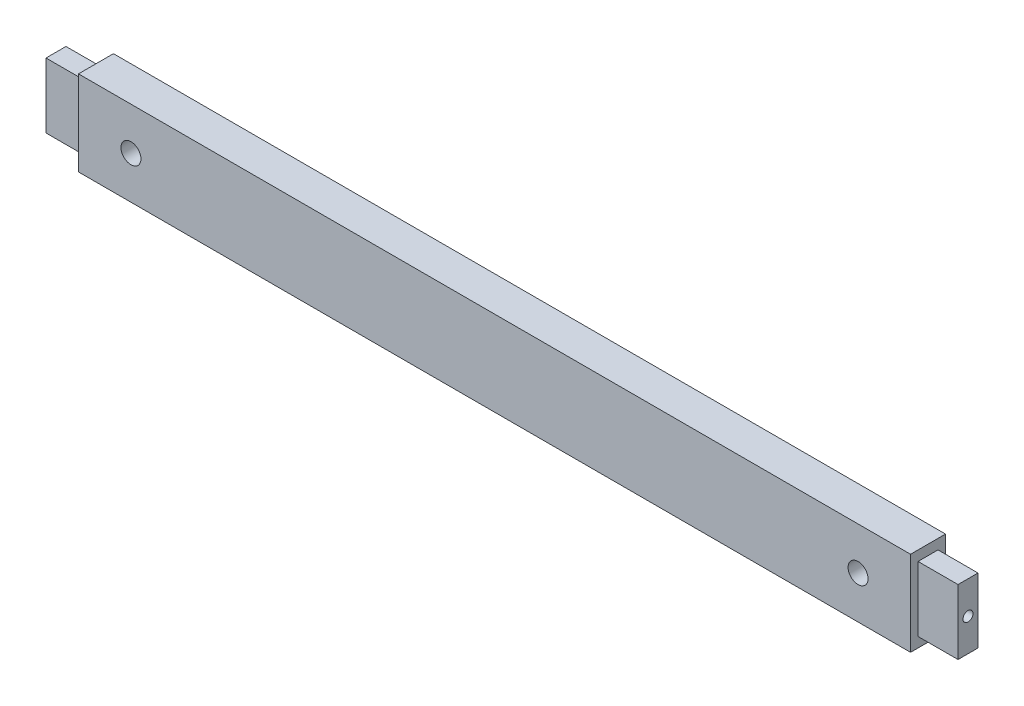
ISO-10303-21;
HEADER;
FILE_DESCRIPTION(('STEP AP214'),'2;1');
FILE_NAME('part.step','',(''),(''),'','','');
FILE_SCHEMA(('AUTOMOTIVE_DESIGN { 1 0 10303 214 1 1 1 1 }'));
ENDSEC;
DATA;
#1=APPLICATION_CONTEXT('core data for automotive mechanical design processes');
#2=APPLICATION_PROTOCOL_DEFINITION('international standard','automotive_design',2000,#1);
#3=PRODUCT_CONTEXT('',#1,'mechanical');
#4=PRODUCT('Part','Part','',(#3));
#5=PRODUCT_RELATED_PRODUCT_CATEGORY('part','',(#4));
#6=PRODUCT_DEFINITION_FORMATION('','',#4);
#7=PRODUCT_DEFINITION_CONTEXT('part definition',#1,'design');
#8=PRODUCT_DEFINITION('design','',#6,#7);
#9=PRODUCT_DEFINITION_SHAPE('','',#8);
#10=(LENGTH_UNIT() NAMED_UNIT(*) SI_UNIT(.MILLI.,.METRE.));
#11=(NAMED_UNIT(*) PLANE_ANGLE_UNIT() SI_UNIT($,.RADIAN.));
#12=(NAMED_UNIT(*) SI_UNIT($,.STERADIAN.) SOLID_ANGLE_UNIT());
#13=UNCERTAINTY_MEASURE_WITH_UNIT(LENGTH_MEASURE(1.E-05),#10,'distance_accuracy_value','');
#14=(GEOMETRIC_REPRESENTATION_CONTEXT(3) GLOBAL_UNCERTAINTY_ASSIGNED_CONTEXT((#13)) GLOBAL_UNIT_ASSIGNED_CONTEXT((#10,
#11,#12)) REPRESENTATION_CONTEXT('',''));
#15=CARTESIAN_POINT('',(0.,0.,0.));
#16=DIRECTION('',(0.,0.,1.));
#17=DIRECTION('',(1.,0.,0.));
#18=AXIS2_PLACEMENT_3D('',#15,#16,#17);
#19=CARTESIAN_POINT('',(0.,0.,-22.225));
#20=DIRECTION('',(0.,0.,-1.));
#21=DIRECTION('',(-1.,0.,0.));
#22=AXIS2_PLACEMENT_3D('',#19,#20,#21);
#23=PLANE('',#22);
#24=CARTESIAN_POINT('',(461.9625,0.,-22.225));
#25=DIRECTION('',(0.,0.,-1.));
#26=DIRECTION('',(-1.,0.,0.));
#27=AXIS2_PLACEMENT_3D('',#24,#25,#26);
#28=CIRCLE('',#27,12.7);
#29=CARTESIAN_POINT('',(449.2625,0.,-22.225));
#30=VERTEX_POINT('',#29);
#31=EDGE_CURVE('E412',#30,#30,#28,.T.);
#32=ORIENTED_EDGE('',*,*,#31,.F.);
#33=EDGE_LOOP('',(#32));
#34=FACE_BOUND('',#33,.T.);
#35=CARTESIAN_POINT('',(-461.962499999999,0.,-22.225));
#36=DIRECTION('',(0.,0.,-1.));
#37=DIRECTION('',(-1.,0.,0.));
#38=AXIS2_PLACEMENT_3D('',#35,#36,#37);
#39=CIRCLE('',#38,12.7);
#40=CARTESIAN_POINT('',(-474.662499999999,0.,-22.225));
#41=VERTEX_POINT('',#40);
#42=EDGE_CURVE('E407',#41,#41,#39,.T.);
#43=ORIENTED_EDGE('',*,*,#42,.F.);
#44=EDGE_LOOP('',(#43));
#45=FACE_BOUND('',#44,.T.);
#46=DIRECTION('',(-1.,0.,0.));
#47=VECTOR('',#46,1.);
#48=CARTESIAN_POINT('',(0.,19.0499999999995,-22.225));
#49=LINE('',#48,#47);
#50=CARTESIAN_POINT('',(528.6375,19.05,-22.225));
#51=VERTEX_POINT('',#50);
#52=CARTESIAN_POINT('',(-528.637499999999,19.0499999999989,-22.225));
#53=VERTEX_POINT('',#52);
#54=EDGE_CURVE('E46',#51,#53,#49,.T.);
#55=ORIENTED_EDGE('',*,*,#54,.F.);
#56=DIRECTION('',(0.,1.,0.));
#57=VECTOR('',#56,1.);
#58=CARTESIAN_POINT('',(528.6375,53.975,-22.225));
#59=LINE('',#58,#57);
#60=CARTESIAN_POINT('',(528.6375,-53.975,-22.225));
#61=VERTEX_POINT('',#60);
#62=EDGE_CURVE('E177',#61,#51,#59,.T.);
#63=ORIENTED_EDGE('',*,*,#62,.F.);
#64=DIRECTION('',(1.,0.,0.));
#65=VECTOR('',#64,1.);
#66=CARTESIAN_POINT('',(528.6375,-53.975,-22.225));
#67=LINE('',#66,#65);
#68=CARTESIAN_POINT('',(-528.637499999999,-53.9750000000001,-22.225));
#69=VERTEX_POINT('',#68);
#70=EDGE_CURVE('E178',#69,#61,#67,.T.);
#71=ORIENTED_EDGE('',*,*,#70,.F.);
#72=DIRECTION('',(0.,-1.,0.));
#73=VECTOR('',#72,1.);
#74=CARTESIAN_POINT('',(-528.637499999999,53.9749999999999,-22.225));
#75=LINE('',#74,#73);
#76=EDGE_CURVE('E373',#53,#69,#75,.T.);
#77=ORIENTED_EDGE('',*,*,#76,.F.);
#78=EDGE_LOOP('',(#55,#63,#71,#77));
#79=FACE_BOUND('',#78,.T.);
#80=ADVANCED_FACE('F33',(#34,#45,#79),#23,.T.);
#81=CARTESIAN_POINT('',(528.6375,53.975,22.225));
#82=DIRECTION('',(-1.,0.,0.));
#83=DIRECTION('',(0.,-1.,0.));
#84=AXIS2_PLACEMENT_3D('',#81,#82,#83);
#85=PLANE('',#84);
#86=ORIENTED_EDGE('',*,*,#62,.T.);
#87=DIRECTION('',(0.,0.,-1.));
#88=VECTOR('',#87,1.);
#89=CARTESIAN_POINT('',(528.6375,19.05,-22.225));
#90=LINE('',#89,#88);
#91=CARTESIAN_POINT('',(528.6375,19.05,-19.05));
#92=VERTEX_POINT('',#91);
#93=EDGE_CURVE('E396',#92,#51,#90,.T.);
#94=ORIENTED_EDGE('',*,*,#93,.F.);
#95=DIRECTION('',(0.,-1.,0.));
#96=VECTOR('',#95,1.);
#97=CARTESIAN_POINT('',(528.6375,28.575,-19.05));
#98=LINE('',#97,#96);
#99=CARTESIAN_POINT('',(528.6375,28.575,-19.05));
#100=VERTEX_POINT('',#99);
#101=EDGE_CURVE('E171',#100,#92,#98,.T.);
#102=ORIENTED_EDGE('',*,*,#101,.F.);
#103=DIRECTION('',(0.,0.,1.));
#104=VECTOR('',#103,1.);
#105=CARTESIAN_POINT('',(528.6375,28.575,-22.225));
#106=LINE('',#105,#104);
#107=CARTESIAN_POINT('',(528.6375,28.575,-22.225));
#108=VERTEX_POINT('',#107);
#109=EDGE_CURVE('E154',#108,#100,#106,.T.);
#110=ORIENTED_EDGE('',*,*,#109,.F.);
#111=CARTESIAN_POINT('',(528.6375,53.975,-22.225));
#112=VERTEX_POINT('',#111);
#113=EDGE_CURVE('E167',#108,#112,#59,.T.);
#114=ORIENTED_EDGE('',*,*,#113,.T.);
#115=DIRECTION('',(0.,0.,-1.));
#116=VECTOR('',#115,1.);
#117=CARTESIAN_POINT('',(528.6375,53.975,22.225));
#118=LINE('',#117,#116);
#119=CARTESIAN_POINT('',(528.6375,53.975,22.225));
#120=VERTEX_POINT('',#119);
#121=EDGE_CURVE('E189',#120,#112,#118,.T.);
#122=ORIENTED_EDGE('',*,*,#121,.F.);
#123=DIRECTION('',(0.,1.,0.));
#124=VECTOR('',#123,1.);
#125=CARTESIAN_POINT('',(528.6375,53.975,22.225));
#126=LINE('',#125,#124);
#127=CARTESIAN_POINT('',(528.6375,-53.975,22.225));
#128=VERTEX_POINT('',#127);
#129=EDGE_CURVE('E378',#128,#120,#126,.T.);
#130=ORIENTED_EDGE('',*,*,#129,.F.);
#131=DIRECTION('',(0.,0.,-1.));
#132=VECTOR('',#131,1.);
#133=CARTESIAN_POINT('',(528.6375,-53.975,22.225));
#134=LINE('',#133,#132);
#135=EDGE_CURVE('E192',#128,#61,#134,.T.);
#136=ORIENTED_EDGE('',*,*,#135,.T.);
#137=EDGE_LOOP('',(#86,#94,#102,#110,#114,#122,#130,#136));
#138=FACE_BOUND('',#137,.T.);
#139=DIRECTION('',(0.,-1.,0.));
#140=VECTOR('',#139,1.);
#141=CARTESIAN_POINT('',(528.6375,41.2750000000005,12.7));
#142=LINE('',#141,#140);
#143=CARTESIAN_POINT('',(528.6375,41.2750000000005,12.7));
#144=VERTEX_POINT('',#143);
#145=CARTESIAN_POINT('',(528.6375,-41.2749999999994,12.7));
#146=VERTEX_POINT('',#145);
#147=EDGE_CURVE('E340',#144,#146,#142,.T.);
#148=ORIENTED_EDGE('',*,*,#147,.F.);
#149=DIRECTION('',(0.,0.,1.));
#150=VECTOR('',#149,1.);
#151=CARTESIAN_POINT('',(528.6375,41.2750000000005,-12.7));
#152=LINE('',#151,#150);
#153=CARTESIAN_POINT('',(528.6375,41.2750000000005,-12.7));
#154=VERTEX_POINT('',#153);
#155=EDGE_CURVE('E345',#154,#144,#152,.T.);
#156=ORIENTED_EDGE('',*,*,#155,.F.);
#157=DIRECTION('',(0.,1.,0.));
#158=VECTOR('',#157,1.);
#159=CARTESIAN_POINT('',(528.6375,41.2750000000005,-12.7));
#160=LINE('',#159,#158);
#161=CARTESIAN_POINT('',(528.6375,-41.2749999999995,-12.7));
#162=VERTEX_POINT('',#161);
#163=EDGE_CURVE('E357',#162,#154,#160,.T.);
#164=ORIENTED_EDGE('',*,*,#163,.F.);
#165=DIRECTION('',(0.,0.,-1.));
#166=VECTOR('',#165,1.);
#167=CARTESIAN_POINT('',(528.6375,-41.2749999999995,-12.7));
#168=LINE('',#167,#166);
#169=EDGE_CURVE('E354',#146,#162,#168,.T.);
#170=ORIENTED_EDGE('',*,*,#169,.F.);
#171=EDGE_LOOP('',(#148,#156,#164,#170));
#172=FACE_BOUND('',#171,.T.);
#173=ADVANCED_FACE('F164',(#138,#172),#85,.F.);
#174=CARTESIAN_POINT('',(-528.637499999999,53.9749999999999,22.225));
#175=DIRECTION('',(1.,0.,0.));
#176=DIRECTION('',(0.,0.,-1.));
#177=AXIS2_PLACEMENT_3D('',#174,#175,#176);
#178=PLANE('',#177);
#179=DIRECTION('',(0.,0.,1.));
#180=VECTOR('',#179,1.);
#181=CARTESIAN_POINT('',(-528.6375,41.2750000000005,-12.7));
#182=LINE('',#181,#180);
#183=CARTESIAN_POINT('',(-528.6375,41.2750000000005,-12.7));
#184=VERTEX_POINT('',#183);
#185=CARTESIAN_POINT('',(-528.6375,41.2750000000005,12.7));
#186=VERTEX_POINT('',#185);
#187=EDGE_CURVE('E326',#184,#186,#182,.T.);
#188=ORIENTED_EDGE('',*,*,#187,.T.);
#189=DIRECTION('',(0.,-1.,0.));
#190=VECTOR('',#189,1.);
#191=CARTESIAN_POINT('',(-528.6375,41.2750000000005,12.7));
#192=LINE('',#191,#190);
#193=CARTESIAN_POINT('',(-528.6375,-41.2749999999995,12.7));
#194=VERTEX_POINT('',#193);
#195=EDGE_CURVE('E323',#186,#194,#192,.T.);
#196=ORIENTED_EDGE('',*,*,#195,.T.);
#197=DIRECTION('',(0.,0.,-1.));
#198=VECTOR('',#197,1.);
#199=CARTESIAN_POINT('',(-528.6375,-41.2749999999995,-12.7));
#200=LINE('',#199,#198);
#201=CARTESIAN_POINT('',(-528.637499999999,-41.2749999999995,-12.7));
#202=VERTEX_POINT('',#201);
#203=EDGE_CURVE('E310',#194,#202,#200,.T.);
#204=ORIENTED_EDGE('',*,*,#203,.T.);
#205=DIRECTION('',(0.,1.,0.));
#206=VECTOR('',#205,1.);
#207=CARTESIAN_POINT('',(-528.6375,41.2750000000005,-12.7));
#208=LINE('',#207,#206);
#209=EDGE_CURVE('E62',#202,#184,#208,.T.);
#210=ORIENTED_EDGE('',*,*,#209,.T.);
#211=EDGE_LOOP('',(#188,#196,#204,#210));
#212=FACE_BOUND('',#211,.T.);
#213=DIRECTION('',(0.,-1.,0.));
#214=VECTOR('',#213,1.);
#215=CARTESIAN_POINT('',(-528.637499999999,53.9749999999999,-19.05));
#216=LINE('',#215,#214);
#217=CARTESIAN_POINT('',(-528.637499999999,28.5749999999989,-19.05));
#218=VERTEX_POINT('',#217);
#219=CARTESIAN_POINT('',(-528.637499999999,19.0499999999989,-19.05));
#220=VERTEX_POINT('',#219);
#221=EDGE_CURVE('E11',#218,#220,#216,.T.);
#222=ORIENTED_EDGE('',*,*,#221,.T.);
#223=DIRECTION('',(0.,0.,-1.));
#224=VECTOR('',#223,1.);
#225=CARTESIAN_POINT('',(-528.637499999999,19.0499999999989,22.225));
#226=LINE('',#225,#224);
#227=EDGE_CURVE('E386',#220,#53,#226,.T.);
#228=ORIENTED_EDGE('',*,*,#227,.T.);
#229=ORIENTED_EDGE('',*,*,#76,.T.);
#230=DIRECTION('',(0.,0.,-1.));
#231=VECTOR('',#230,1.);
#232=CARTESIAN_POINT('',(-528.637499999999,-53.9750000000001,22.225));
#233=LINE('',#232,#231);
#234=CARTESIAN_POINT('',(-528.637499999999,-53.9750000000001,22.225));
#235=VERTEX_POINT('',#234);
#236=EDGE_CURVE('E160',#235,#69,#233,.T.);
#237=ORIENTED_EDGE('',*,*,#236,.F.);
#238=DIRECTION('',(0.,-1.,0.));
#239=VECTOR('',#238,1.);
#240=CARTESIAN_POINT('',(-528.637499999999,53.9749999999999,22.225));
#241=LINE('',#240,#239);
#242=CARTESIAN_POINT('',(-528.637499999999,53.9749999999999,22.225));
#243=VERTEX_POINT('',#242);
#244=EDGE_CURVE('E185',#243,#235,#241,.T.);
#245=ORIENTED_EDGE('',*,*,#244,.F.);
#246=DIRECTION('',(0.,0.,-1.));
#247=VECTOR('',#246,1.);
#248=CARTESIAN_POINT('',(-528.637499999999,53.9749999999999,22.225));
#249=LINE('',#248,#247);
#250=CARTESIAN_POINT('',(-528.637499999999,53.9749999999999,-22.225));
#251=VERTEX_POINT('',#250);
#252=EDGE_CURVE('E186',#243,#251,#249,.T.);
#253=ORIENTED_EDGE('',*,*,#252,.T.);
#254=CARTESIAN_POINT('',(-528.637499999999,28.5749999999995,-22.225));
#255=VERTEX_POINT('',#254);
#256=EDGE_CURVE('E180',#251,#255,#75,.T.);
#257=ORIENTED_EDGE('',*,*,#256,.T.);
#258=DIRECTION('',(0.,0.,1.));
#259=VECTOR('',#258,1.);
#260=CARTESIAN_POINT('',(-528.637499999999,28.574999999999,22.225));
#261=LINE('',#260,#259);
#262=EDGE_CURVE('E54',#255,#218,#261,.T.);
#263=ORIENTED_EDGE('',*,*,#262,.T.);
#264=EDGE_LOOP('',(#222,#228,#229,#237,#245,#253,#257,#263));
#265=FACE_BOUND('',#264,.T.);
#266=ADVANCED_FACE('F35',(#212,#265),#178,.F.);
#267=CARTESIAN_POINT('',(528.6375,-53.975,22.225));
#268=DIRECTION('',(0.,1.,0.));
#269=DIRECTION('',(-1.,0.,0.));
#270=AXIS2_PLACEMENT_3D('',#267,#268,#269);
#271=PLANE('',#270);
#272=ORIENTED_EDGE('',*,*,#70,.T.);
#273=ORIENTED_EDGE('',*,*,#135,.F.);
#274=DIRECTION('',(1.,0.,0.));
#275=VECTOR('',#274,1.);
#276=CARTESIAN_POINT('',(528.6375,-53.975,22.225));
#277=LINE('',#276,#275);
#278=EDGE_CURVE('E376',#235,#128,#277,.T.);
#279=ORIENTED_EDGE('',*,*,#278,.F.);
#280=ORIENTED_EDGE('',*,*,#236,.T.);
#281=EDGE_LOOP('',(#272,#273,#279,#280));
#282=FACE_BOUND('',#281,.T.);
#283=ADVANCED_FACE('F250',(#282),#271,.F.);
#284=CARTESIAN_POINT('',(528.6375,53.975,22.225));
#285=DIRECTION('',(0.,-1.,0.));
#286=DIRECTION('',(1.,0.,0.));
#287=AXIS2_PLACEMENT_3D('',#284,#285,#286);
#288=PLANE('',#287);
#289=DIRECTION('',(-1.,0.,0.));
#290=VECTOR('',#289,1.);
#291=CARTESIAN_POINT('',(528.6375,53.975,-22.225));
#292=LINE('',#291,#290);
#293=EDGE_CURVE('E176',#112,#251,#292,.T.);
#294=ORIENTED_EDGE('',*,*,#293,.T.);
#295=ORIENTED_EDGE('',*,*,#252,.F.);
#296=DIRECTION('',(-1.,0.,0.));
#297=VECTOR('',#296,1.);
#298=CARTESIAN_POINT('',(528.6375,53.975,22.225));
#299=LINE('',#298,#297);
#300=EDGE_CURVE('E190',#120,#243,#299,.T.);
#301=ORIENTED_EDGE('',*,*,#300,.F.);
#302=ORIENTED_EDGE('',*,*,#121,.T.);
#303=EDGE_LOOP('',(#294,#295,#301,#302));
#304=FACE_BOUND('',#303,.T.);
#305=ADVANCED_FACE('F245',(#304),#288,.F.);
#306=CARTESIAN_POINT('',(0.,0.,22.225));
#307=DIRECTION('',(0.,0.,-1.));
#308=DIRECTION('',(-1.,0.,0.));
#309=AXIS2_PLACEMENT_3D('',#306,#307,#308);
#310=PLANE('',#309);
#311=CARTESIAN_POINT('',(461.9625,0.,22.225));
#312=DIRECTION('',(0.,0.,-1.));
#313=DIRECTION('',(-1.,0.,0.));
#314=AXIS2_PLACEMENT_3D('',#311,#312,#313);
#315=CIRCLE('',#314,12.7);
#316=CARTESIAN_POINT('',(449.2625,0.,22.225));
#317=VERTEX_POINT('',#316);
#318=EDGE_CURVE('E415',#317,#317,#315,.T.);
#319=ORIENTED_EDGE('',*,*,#318,.T.);
#320=EDGE_LOOP('',(#319));
#321=FACE_BOUND('',#320,.T.);
#322=CARTESIAN_POINT('',(-461.962499999999,0.,22.225));
#323=DIRECTION('',(0.,0.,-1.));
#324=DIRECTION('',(-1.,0.,0.));
#325=AXIS2_PLACEMENT_3D('',#322,#323,#324);
#326=CIRCLE('',#325,12.7);
#327=CARTESIAN_POINT('',(-474.662499999999,0.,22.225));
#328=VERTEX_POINT('',#327);
#329=EDGE_CURVE('E202',#328,#328,#326,.T.);
#330=ORIENTED_EDGE('',*,*,#329,.T.);
#331=EDGE_LOOP('',(#330));
#332=FACE_BOUND('',#331,.T.);
#333=ORIENTED_EDGE('',*,*,#244,.T.);
#334=ORIENTED_EDGE('',*,*,#278,.T.);
#335=ORIENTED_EDGE('',*,*,#129,.T.);
#336=ORIENTED_EDGE('',*,*,#300,.T.);
#337=EDGE_LOOP('',(#333,#334,#335,#336));
#338=FACE_BOUND('',#337,.T.);
#339=ADVANCED_FACE('F237',(#321,#332,#338),#310,.F.);
#340=DIRECTION('',(1.,0.,0.));
#341=VECTOR('',#340,1.);
#342=CARTESIAN_POINT('',(0.,28.5749999999995,-22.225));
#343=LINE('',#342,#341);
#344=EDGE_CURVE('E151',#255,#108,#343,.T.);
#345=ORIENTED_EDGE('',*,*,#344,.F.);
#346=ORIENTED_EDGE('',*,*,#256,.F.);
#347=ORIENTED_EDGE('',*,*,#293,.F.);
#348=ORIENTED_EDGE('',*,*,#113,.F.);
#349=EDGE_LOOP('',(#345,#346,#347,#348));
#350=FACE_BOUND('',#349,.T.);
#351=ADVANCED_FACE('F175',(#350),#23,.T.);
#352=CARTESIAN_POINT('',(579.4375,41.2750000000006,12.7));
#353=DIRECTION('',(0.,0.,-1.));
#354=DIRECTION('',(0.,1.,0.));
#355=AXIS2_PLACEMENT_3D('',#352,#353,#354);
#356=PLANE('',#355);
#357=ORIENTED_EDGE('',*,*,#147,.T.);
#358=DIRECTION('',(-1.,0.,0.));
#359=VECTOR('',#358,1.);
#360=CARTESIAN_POINT('',(579.4375,-41.2749999999994,12.7));
#361=LINE('',#360,#359);
#362=CARTESIAN_POINT('',(579.4375,-41.2749999999994,12.7));
#363=VERTEX_POINT('',#362);
#364=EDGE_CURVE('E370',#363,#146,#361,.T.);
#365=ORIENTED_EDGE('',*,*,#364,.F.);
#366=DIRECTION('',(0.,-1.,0.));
#367=VECTOR('',#366,1.);
#368=CARTESIAN_POINT('',(579.4375,41.2750000000006,12.7));
#369=LINE('',#368,#367);
#370=CARTESIAN_POINT('',(579.4375,41.2750000000006,12.7));
#371=VERTEX_POINT('',#370);
#372=EDGE_CURVE('E341',#371,#363,#369,.T.);
#373=ORIENTED_EDGE('',*,*,#372,.F.);
#374=DIRECTION('',(-1.,0.,0.));
#375=VECTOR('',#374,1.);
#376=CARTESIAN_POINT('',(579.4375,41.2750000000006,12.7));
#377=LINE('',#376,#375);
#378=EDGE_CURVE('E351',#371,#144,#377,.T.);
#379=ORIENTED_EDGE('',*,*,#378,.T.);
#380=EDGE_LOOP('',(#357,#365,#373,#379));
#381=FACE_BOUND('',#380,.T.);
#382=ADVANCED_FACE('F236',(#381),#356,.F.);
#383=CARTESIAN_POINT('',(579.4375,-41.2749999999994,-12.7));
#384=DIRECTION('',(0.,1.,0.));
#385=DIRECTION('',(-1.,0.,0.));
#386=AXIS2_PLACEMENT_3D('',#383,#384,#385);
#387=PLANE('',#386);
#388=ORIENTED_EDGE('',*,*,#169,.T.);
#389=DIRECTION('',(-1.,0.,0.));
#390=VECTOR('',#389,1.);
#391=CARTESIAN_POINT('',(579.4375,-41.2749999999994,-12.7));
#392=LINE('',#391,#390);
#393=CARTESIAN_POINT('',(579.4375,-41.2749999999994,-12.7));
#394=VERTEX_POINT('',#393);
#395=EDGE_CURVE('E367',#394,#162,#392,.T.);
#396=ORIENTED_EDGE('',*,*,#395,.F.);
#397=DIRECTION('',(0.,0.,-1.));
#398=VECTOR('',#397,1.);
#399=CARTESIAN_POINT('',(579.4375,-41.2749999999994,-12.7));
#400=LINE('',#399,#398);
#401=EDGE_CURVE('E344',#363,#394,#400,.T.);
#402=ORIENTED_EDGE('',*,*,#401,.F.);
#403=ORIENTED_EDGE('',*,*,#364,.T.);
#404=EDGE_LOOP('',(#388,#396,#402,#403));
#405=FACE_BOUND('',#404,.T.);
#406=ADVANCED_FACE('F242',(#405),#387,.F.);
#407=CARTESIAN_POINT('',(579.4375,41.2750000000006,-12.7));
#408=DIRECTION('',(0.,0.,1.));
#409=DIRECTION('',(0.,-1.,0.));
#410=AXIS2_PLACEMENT_3D('',#407,#408,#409);
#411=PLANE('',#410);
#412=ORIENTED_EDGE('',*,*,#163,.T.);
#413=DIRECTION('',(-1.,0.,0.));
#414=VECTOR('',#413,1.);
#415=CARTESIAN_POINT('',(579.4375,41.2750000000006,-12.7));
#416=LINE('',#415,#414);
#417=CARTESIAN_POINT('',(579.4375,41.2750000000006,-12.7));
#418=VERTEX_POINT('',#417);
#419=EDGE_CURVE('E364',#418,#154,#416,.T.);
#420=ORIENTED_EDGE('',*,*,#419,.F.);
#421=DIRECTION('',(0.,1.,0.));
#422=VECTOR('',#421,1.);
#423=CARTESIAN_POINT('',(579.4375,41.2750000000006,-12.7));
#424=LINE('',#423,#422);
#425=EDGE_CURVE('E347',#394,#418,#424,.T.);
#426=ORIENTED_EDGE('',*,*,#425,.F.);
#427=ORIENTED_EDGE('',*,*,#395,.T.);
#428=EDGE_LOOP('',(#412,#420,#426,#427));
#429=FACE_BOUND('',#428,.T.);
#430=ADVANCED_FACE('F257',(#429),#411,.F.);
#431=CARTESIAN_POINT('',(579.4375,41.2750000000006,-12.7));
#432=DIRECTION('',(0.,-1.,0.));
#433=DIRECTION('',(1.,0.,0.));
#434=AXIS2_PLACEMENT_3D('',#431,#432,#433);
#435=PLANE('',#434);
#436=ORIENTED_EDGE('',*,*,#155,.T.);
#437=ORIENTED_EDGE('',*,*,#378,.F.);
#438=DIRECTION('',(0.,0.,1.));
#439=VECTOR('',#438,1.);
#440=CARTESIAN_POINT('',(579.4375,41.2750000000006,-12.7));
#441=LINE('',#440,#439);
#442=EDGE_CURVE('E349',#418,#371,#441,.T.);
#443=ORIENTED_EDGE('',*,*,#442,.F.);
#444=ORIENTED_EDGE('',*,*,#419,.T.);
#445=EDGE_LOOP('',(#436,#437,#443,#444));
#446=FACE_BOUND('',#445,.T.);
#447=ADVANCED_FACE('F261',(#446),#435,.F.);
#448=CARTESIAN_POINT('',(579.4375,0.,0.));
#449=DIRECTION('',(-1.,0.,0.));
#450=DIRECTION('',(0.,0.,1.));
#451=AXIS2_PLACEMENT_3D('',#448,#449,#450);
#452=PLANE('',#451);
#453=CARTESIAN_POINT('',(579.4375,0.,0.));
#454=DIRECTION('',(1.,0.,0.));
#455=DIRECTION('',(0.,0.,-1.));
#456=AXIS2_PLACEMENT_3D('',#453,#454,#455);
#457=CIRCLE('',#456,6.35);
#458=CARTESIAN_POINT('',(579.4375,0.,-6.35));
#459=VERTEX_POINT('',#458);
#460=EDGE_CURVE('E337',#459,#459,#457,.T.);
#461=ORIENTED_EDGE('',*,*,#460,.F.);
#462=EDGE_LOOP('',(#461));
#463=FACE_BOUND('',#462,.T.);
#464=ORIENTED_EDGE('',*,*,#372,.T.);
#465=ORIENTED_EDGE('',*,*,#401,.T.);
#466=ORIENTED_EDGE('',*,*,#425,.T.);
#467=ORIENTED_EDGE('',*,*,#442,.T.);
#468=EDGE_LOOP('',(#464,#465,#466,#467));
#469=FACE_BOUND('',#468,.T.);
#470=ADVANCED_FACE('F265',(#463,#469),#452,.F.);
#471=CARTESIAN_POINT('',(461.9625,0.,0.));
#472=DIRECTION('',(1.,0.,0.));
#473=DIRECTION('',(0.,0.,-1.));
#474=AXIS2_PLACEMENT_3D('',#471,#472,#473);
#475=CYLINDRICAL_SURFACE('',#474,6.35);
#476=CARTESIAN_POINT('',(474.6625,0.,-6.35));
#477=CARTESIAN_POINT('',(474.662499489178,-0.166990879194913,-6.34999944217588));
#478=CARTESIAN_POINT('',(474.659198672826,-0.33399345019863,-6.34340517119929));
#479=CARTESIAN_POINT('',(474.646078620322,-0.666768526640044,-6.31710332866815));
#480=CARTESIAN_POINT('',(474.636256548452,-0.832540465223129,-6.29739005240762));
#481=CARTESIAN_POINT('',(474.610329247809,-1.16177467728403,-6.24504620131107));
#482=CARTESIAN_POINT('',(474.594215058958,-1.32523331106835,-6.21239720481971));
#483=CARTESIAN_POINT('',(474.556108506232,-1.64849348247789,-6.13454367002308));
#484=CARTESIAN_POINT('',(474.53411373985,-1.80829349634147,-6.0893339997623));
#485=CARTESIAN_POINT('',(474.484895914273,-2.12244180878878,-5.98706118032938));
#486=CARTESIAN_POINT('',(474.457695965081,-2.27681076158407,-5.9300503379438));
#487=CARTESIAN_POINT('',(474.398650269919,-2.57993454237573,-5.80460027805888));
#488=CARTESIAN_POINT('',(474.366802784377,-2.72868724185101,-5.73615677992335));
#489=CARTESIAN_POINT('',(474.265381193969,-3.16512812193646,-5.51459167351378));
#490=CARTESIAN_POINT('',(474.189871335403,-3.44334503957524,-5.34512164103921));
#491=CARTESIAN_POINT('',(474.024718677387,-3.98471796121715,-4.95605749398617));
#492=CARTESIAN_POINT('',(473.934497231219,-4.24594454614363,-4.73405124179345));
#493=CARTESIAN_POINT('',(473.751896014884,-4.72936553155196,-4.25114819119642));
#494=CARTESIAN_POINT('',(473.659514660148,-4.95153018780438,-3.99022203374431));
#495=CARTESIAN_POINT('',(473.522824339822,-5.25955398778228,-3.56282486670931));
#496=CARTESIAN_POINT('',(473.475972148548,-5.3610627049131,-3.40820389376143));
#497=CARTESIAN_POINT('',(473.385809949723,-5.55058368760464,-3.08994761547518));
#498=CARTESIAN_POINT('',(473.342498468069,-5.63860158329209,-2.92631610947029));
#499=CARTESIAN_POINT('',(473.260909805789,-5.800358082891,-2.59094786440526));
#500=CARTESIAN_POINT('',(473.222632294573,-5.87409762464253,-2.41921165860543));
#501=CARTESIAN_POINT('',(473.152588210094,-6.00645788836519,-2.06881694320016));
#502=CARTESIAN_POINT('',(473.120817791759,-6.06508754416237,-1.89016259620783));
#503=CARTESIAN_POINT('',(473.066759497995,-6.16347180761614,-1.5380237910296));
#504=CARTESIAN_POINT('',(473.04401961136,-6.20414249112448,-1.36486498251088));
#505=CARTESIAN_POINT('',(473.00638048444,-6.27089941680448,-1.01491009009551));
#506=CARTESIAN_POINT('',(472.99148090876,-6.29698628284913,-0.838114162124659));
#507=CARTESIAN_POINT('',(472.970176308681,-6.33415533919377,-0.482590705235789));
#508=CARTESIAN_POINT('',(472.963764099381,-6.34525022098377,-0.303864939404376));
#509=CARTESIAN_POINT('',(472.959700488672,-6.35229110757549,0.0539765423064435));
#510=CARTESIAN_POINT('',(472.962048251405,-6.34823855771195,0.233092219351485));
#511=CARTESIAN_POINT('',(472.974590292946,-6.32645177136463,0.568582301875061));
#512=CARTESIAN_POINT('',(472.983809583329,-6.31041699475489,0.725107359870217));
#513=CARTESIAN_POINT('',(473.008628374712,-6.2668713449148,1.03609053465783));
#514=CARTESIAN_POINT('',(473.024229978982,-6.23935668847138,1.19054795272156));
#515=CARTESIAN_POINT('',(473.061302790456,-6.1731687344852,1.49631129670201));
#516=CARTESIAN_POINT('',(473.082773227066,-6.13449690187388,1.64761763355948));
#517=CARTESIAN_POINT('',(473.130919038309,-6.04639785576763,1.94623864200334));
#518=CARTESIAN_POINT('',(473.15759645801,-5.99696641549927,2.09355171924188));
#519=CARTESIAN_POINT('',(473.245637611808,-5.83067999912413,2.53492872693472));
#520=CARTESIAN_POINT('',(473.314125656313,-5.69733157989736,2.82155056219387));
#521=CARTESIAN_POINT('',(473.462571400071,-5.39139880582654,3.36957685011722));
#522=CARTESIAN_POINT('',(473.542534245228,-5.21879682720649,3.63096990042999));
#523=CARTESIAN_POINT('',(473.717181288204,-4.81373716307424,4.15618743095878));
#524=CARTESIAN_POINT('',(473.812446508613,-4.57646495884523,4.41611767035084));
#525=CARTESIAN_POINT('',(473.998785476425,-4.0611227505291,4.89420340086183));
#526=CARTESIAN_POINT('',(474.089857204944,-3.78303336001455,5.11233892714115));
#527=CARTESIAN_POINT('',(474.218438857257,-3.33286643739697,5.40822137451721));
#528=CARTESIAN_POINT('',(474.26080502543,-3.17335722609791,5.50335984672242));
#529=CARTESIAN_POINT('',(474.340721830176,-2.84569771626438,5.67970671124367));
#530=CARTESIAN_POINT('',(474.378274629749,-2.67755134695862,5.76092136612927));
#531=CARTESIAN_POINT('',(474.447457929256,-2.33378760343931,5.90854657110693));
#532=CARTESIAN_POINT('',(474.479090729346,-2.15817316355138,5.97496287286555));
#533=CARTESIAN_POINT('',(474.535487636006,-1.80074808519267,6.09222165998248));
#534=CARTESIAN_POINT('',(474.560252532703,-1.61893816219402,6.14306593691524));
#535=CARTESIAN_POINT('',(474.600391559762,-1.26593635485429,6.22494695974544));
#536=CARTESIAN_POINT('',(474.616373645966,-1.09511243698787,6.25727558630872));
#537=CARTESIAN_POINT('',(474.641456242038,-0.750891318848442,6.30784558836317));
#538=CARTESIAN_POINT('',(474.650557126214,-0.577494259066555,6.32608773009978));
#539=CARTESIAN_POINT('',(474.661615837058,-0.229629611373424,6.34823872389932));
#540=CARTESIAN_POINT('',(474.663576519709,-0.0551624794535693,6.35215330679286));
#541=CARTESIAN_POINT('',(474.660305903488,0.293430507417565,6.34561139205059));
#542=CARTESIAN_POINT('',(474.655074922904,0.46755637713083,6.33515553041994));
#543=CARTESIAN_POINT('',(474.638255509451,0.800509536744069,6.30138636847944));
#544=CARTESIAN_POINT('',(474.627193478102,0.959472887164149,6.27913692599813));
#545=CARTESIAN_POINT('',(474.599345956445,1.2748284005213,6.22277883751831));
#546=CARTESIAN_POINT('',(474.582558523108,1.43121967165999,6.1886661654175));
#547=CARTESIAN_POINT('',(474.543659973299,1.74030776864039,6.10895204704105));
#548=CARTESIAN_POINT('',(474.521550563081,1.89300576133386,6.06335428272778));
#549=CARTESIAN_POINT('',(474.472497179298,2.19390570072535,5.96108560894157));
#550=CARTESIAN_POINT('',(474.44555132453,2.34210587161404,5.90441038996764));
#551=CARTESIAN_POINT('',(474.386595177989,2.6372585623889,5.77873770602808));
#552=CARTESIAN_POINT('',(474.354463563851,2.78405822350622,5.70943799490311));
#553=CARTESIAN_POINT('',(474.28642525103,3.07126756713196,5.56021860592231));
#554=CARTESIAN_POINT('',(474.25051727352,3.21167506178123,5.4802953280643));
#555=CARTESIAN_POINT('',(474.138274129222,3.62227376445689,5.22545088631857));
#556=CARTESIAN_POINT('',(474.057387708283,3.8819954012841,5.03538892121195));
#557=CARTESIAN_POINT('',(473.881949948304,4.39279994151145,4.59886015583266));
#558=CARTESIAN_POINT('',(473.786836723692,4.64052990372701,4.34868719486684));
#559=CARTESIAN_POINT('',(473.646477281117,4.9789239543965,3.94508991014852));
#560=CARTESIAN_POINT('',(473.600043256276,5.08625380253176,3.80572389485982));
#561=CARTESIAN_POINT('',(473.509173404949,5.28929908879008,3.51806625732098));
#562=CARTESIAN_POINT('',(473.464737878047,5.38501278922794,3.3697733046221));
#563=CARTESIAN_POINT('',(473.377083803972,5.56849389071525,3.05757189938893));
#564=CARTESIAN_POINT('',(473.334030491655,5.65564549590477,2.89325455594918));
#565=CARTESIAN_POINT('',(473.253079644901,5.81556909376681,2.55662946610005));
#566=CARTESIAN_POINT('',(473.215179627994,5.88834801781484,2.38432562101098));
#567=CARTESIAN_POINT('',(473.145997992612,6.01870593214495,2.03292083584069));
#568=CARTESIAN_POINT('',(473.114711065454,6.07629712370974,1.85382548494068));
#569=CARTESIAN_POINT('',(473.060049579661,6.17556605056229,1.49010166197981));
#570=CARTESIAN_POINT('',(473.036673795983,6.21724624980146,1.30547405141577));
#571=CARTESIAN_POINT('',(473.000721566145,6.28083303239844,0.950261741474642));
#572=CARTESIAN_POINT('',(472.987323858997,6.30425367574493,0.780030300815063));
#573=CARTESIAN_POINT('',(472.968406861867,6.33722186745437,0.437794026308628));
#574=CARTESIAN_POINT('',(472.962887036091,6.34677035930014,0.265789313868239));
#575=CARTESIAN_POINT('',(472.959956108837,6.3518475564986,-0.0784312834340624));
#576=CARTESIAN_POINT('',(472.962542008161,6.34738144738997,-0.25064706662621));
#577=CARTESIAN_POINT('',(472.97570735949,6.32451076696087,-0.593833666046306));
#578=CARTESIAN_POINT('',(472.986286484255,6.3061067662514,-0.764804532951276));
#579=CARTESIAN_POINT('',(473.013631271271,6.25804920718462,-1.08782968989589));
#580=CARTESIAN_POINT('',(473.029708502891,6.22963986719981,-1.24012931802115));
#581=CARTESIAN_POINT('',(473.067526837362,6.16196939123336,-1.5416003606676));
#582=CARTESIAN_POINT('',(473.0892698206,6.12270465222518,-1.69077071883264));
#583=CARTESIAN_POINT('',(473.162048594063,5.98919755549727,-2.13222433158772));
#584=CARTESIAN_POINT('',(473.220653110889,5.87921095671373,-2.41865701909235));
#585=CARTESIAN_POINT('',(473.35621559449,5.61221709335547,-2.98851600553177));
#586=CARTESIAN_POINT('',(473.434142111352,5.4525471930957,-3.27044739745235));
#587=CARTESIAN_POINT('',(473.597939817654,5.09367320950779,-3.80537307337073));
#588=CARTESIAN_POINT('',(473.683815127909,4.89444855823948,-4.05835219423338));
#589=CARTESIAN_POINT('',(473.866369911072,4.43354035272873,-4.5602382551382));
#590=CARTESIAN_POINT('',(473.96309430763,4.16720894914421,-4.80491543273466));
#591=CARTESIAN_POINT('',(474.10083108109,3.73813634318359,-5.13630604997411));
#592=CARTESIAN_POINT('',(474.145552921756,3.5900456973254,-5.24090509195393));
#593=CARTESIAN_POINT('',(474.231387247813,3.28473589884859,-5.43745517759956));
#594=CARTESIAN_POINT('',(474.272501373824,3.12752095014408,-5.52941198125967));
#595=CARTESIAN_POINT('',(474.35030554059,2.80361177397838,-5.70053310851474));
#596=CARTESIAN_POINT('',(474.386959199977,2.63685404738458,-5.7795938199596));
#597=CARTESIAN_POINT('',(474.454411529099,2.29614399762543,-5.92320628541839));
#598=CARTESIAN_POINT('',(474.485213074072,2.12219525894014,-5.98776516727644));
#599=CARTESIAN_POINT('',(474.540000810156,1.76872534139743,-6.10151674034032));
#600=CARTESIAN_POINT('',(474.564001855399,1.58921727277206,-6.15074294600228));
#601=CARTESIAN_POINT('',(474.604519952057,1.22585054083136,-6.23333526903367));
#602=CARTESIAN_POINT('',(474.621041574801,1.04199460738349,-6.2667110745812));
#603=CARTESIAN_POINT('',(474.643150071822,0.715063028653907,-6.31123256192435));
#604=CARTESIAN_POINT('',(474.650393603708,0.572548812651066,-6.32575790184796));
#605=CARTESIAN_POINT('',(474.660068853457,0.286692618188966,-6.34514199371929));
#606=CARTESIAN_POINT('',(474.662500438508,0.143350616991768,-6.35000047885508));
#607=CARTESIAN_POINT('',(474.6625,0.,-6.35));
#608=B_SPLINE_CURVE_WITH_KNOTS('',3,(#476,#477,#478,#479,#480,#481,#482,#483,#484,#485,#486,
#487,#488,#489,#490,#491,#492,#493,#494,#495,#496,#497,#498,#499,#500,#501,#502,#503,#504,#505,
#506,#507,#508,#509,#510,#511,#512,#513,#514,#515,#516,#517,#518,#519,#520,#521,#522,#523,#524,
#525,#526,#527,#528,#529,#530,#531,#532,#533,#534,#535,#536,#537,#538,#539,#540,#541,#542,#543,
#544,#545,#546,#547,#548,#549,#550,#551,#552,#553,#554,#555,#556,#557,#558,#559,#560,#561,#562,
#563,#564,#565,#566,#567,#568,#569,#570,#571,#572,#573,#574,#575,#576,#577,#578,#579,#580,#581,
#582,#583,#584,#585,#586,#587,#588,#589,#590,#591,#592,#593,#594,#595,#596,#597,#598,#599,#600,
#601,#602,#603,#604,#605,#606,#607),.UNSPECIFIED.,.T.,.F.,(4,2,2,2,2,2,2,2,2,2,2,2,2,2,2,2,2,2,
2,2,2,2,2,2,2,2,2,2,2,2,2,2,2,2,2,2,2,2,2,2,2,2,2,2,2,2,2,2,2,2,2,2,2,2,2,2,2,2,2,2,2,2,2,2,2,
4),(0.,0.50083122420536,1.00188037372803,1.50364564290689,2.00561622220709,2.50540779268628,
3.00538691725071,4.00425210956756,5.06354639773447,6.12364383897772,6.69546056113469,
7.26703799333406,7.83857787007115,8.40977904053159,8.94696617231635,9.48413032231425,
10.020839449589,10.5574973665628,11.0297819407841,11.5022222802449,11.9746006167424,
12.447164856978,13.4133450583963,14.3799599077215,15.4691385823987,16.558836254714,
17.1296896955319,17.7002857039293,18.2706595507726,18.8409677509571,19.3640345307036,
19.8870728558157,20.4099019497636,20.9327079051584,21.4148301207384,21.8971161172382,
22.3792476958437,22.8615672144633,23.3574791185916,23.8535595025871,24.8452132673351,
25.9342484207189,26.4795520760265,27.0249372042286,27.5969396508644,28.1686655660688,
28.7399307681394,29.3111074690516,29.8274552059119,30.3437678229116,30.8598894217494,
31.3759898919437,31.8427315926275,32.3096283963947,33.2427989036526,34.2386648311406,
35.2350499582129,36.3525027406484,36.9121724680044,37.4715863502977,38.0352942497766,
38.5987244700203,39.1609143479984,39.7227601571806,40.1526787482413,40.5826092051903),.UNSPECIFIED.);
#609=CARTESIAN_POINT('',(474.6625,0.,-6.35));
#610=VERTEX_POINT('',#609);
#611=EDGE_CURVE('E37',#610,#610,#608,.T.);
#612=ORIENTED_EDGE('',*,*,#611,.T.);
#613=EDGE_LOOP('',(#612));
#614=FACE_BOUND('',#613,.T.);
#615=ORIENTED_EDGE('',*,*,#460,.T.);
#616=EDGE_LOOP('',(#615));
#617=FACE_BOUND('',#616,.T.);
#618=ADVANCED_FACE('F268',(#614,#617),#475,.F.);
#619=CARTESIAN_POINT('',(-579.4375,41.2750000000006,12.7));
#620=DIRECTION('',(0.,0.,1.));
#621=DIRECTION('',(0.,-1.,0.));
#622=AXIS2_PLACEMENT_3D('',#619,#620,#621);
#623=PLANE('',#622);
#624=ORIENTED_EDGE('',*,*,#195,.F.);
#625=DIRECTION('',(1.,0.,0.));
#626=VECTOR('',#625,1.);
#627=CARTESIAN_POINT('',(-579.4375,41.2750000000006,12.7));
#628=LINE('',#627,#626);
#629=CARTESIAN_POINT('',(-579.4375,41.2750000000006,12.7));
#630=VERTEX_POINT('',#629);
#631=EDGE_CURVE('E313',#630,#186,#628,.T.);
#632=ORIENTED_EDGE('',*,*,#631,.F.);
#633=DIRECTION('',(0.,-1.,0.));
#634=VECTOR('',#633,1.);
#635=CARTESIAN_POINT('',(-579.4375,41.2750000000006,12.7));
#636=LINE('',#635,#634);
#637=CARTESIAN_POINT('',(-579.4375,-41.2749999999994,12.7));
#638=VERTEX_POINT('',#637);
#639=EDGE_CURVE('E303',#630,#638,#636,.T.);
#640=ORIENTED_EDGE('',*,*,#639,.T.);
#641=DIRECTION('',(1.,0.,0.));
#642=VECTOR('',#641,1.);
#643=CARTESIAN_POINT('',(-579.4375,-41.2749999999994,12.7));
#644=LINE('',#643,#642);
#645=EDGE_CURVE('E322',#638,#194,#644,.T.);
#646=ORIENTED_EDGE('',*,*,#645,.T.);
#647=EDGE_LOOP('',(#624,#632,#640,#646));
#648=FACE_BOUND('',#647,.T.);
#649=ADVANCED_FACE('F273',(#648),#623,.T.);
#650=CARTESIAN_POINT('',(-579.4375,41.2750000000006,-12.7));
#651=DIRECTION('',(0.,1.,0.));
#652=DIRECTION('',(-1.,0.,0.));
#653=AXIS2_PLACEMENT_3D('',#650,#651,#652);
#654=PLANE('',#653);
#655=ORIENTED_EDGE('',*,*,#187,.F.);
#656=DIRECTION('',(1.,0.,0.));
#657=VECTOR('',#656,1.);
#658=CARTESIAN_POINT('',(-579.4375,41.2750000000006,-12.7));
#659=LINE('',#658,#657);
#660=CARTESIAN_POINT('',(-579.4375,41.2750000000006,-12.7));
#661=VERTEX_POINT('',#660);
#662=EDGE_CURVE('E315',#661,#184,#659,.T.);
#663=ORIENTED_EDGE('',*,*,#662,.F.);
#664=DIRECTION('',(0.,0.,1.));
#665=VECTOR('',#664,1.);
#666=CARTESIAN_POINT('',(-579.4375,41.2750000000006,-12.7));
#667=LINE('',#666,#665);
#668=EDGE_CURVE('E306',#661,#630,#667,.T.);
#669=ORIENTED_EDGE('',*,*,#668,.T.);
#670=ORIENTED_EDGE('',*,*,#631,.T.);
#671=EDGE_LOOP('',(#655,#663,#669,#670));
#672=FACE_BOUND('',#671,.T.);
#673=ADVANCED_FACE('F277',(#672),#654,.T.);
#674=CARTESIAN_POINT('',(-579.4375,41.2750000000006,-12.7));
#675=DIRECTION('',(0.,0.,-1.));
#676=DIRECTION('',(0.,1.,0.));
#677=AXIS2_PLACEMENT_3D('',#674,#675,#676);
#678=PLANE('',#677);
#679=ORIENTED_EDGE('',*,*,#209,.F.);
#680=DIRECTION('',(1.,0.,0.));
#681=VECTOR('',#680,1.);
#682=CARTESIAN_POINT('',(-579.4375,-41.2749999999994,-12.7));
#683=LINE('',#682,#681);
#684=CARTESIAN_POINT('',(-579.4375,-41.2749999999994,-12.7));
#685=VERTEX_POINT('',#684);
#686=EDGE_CURVE('E333',#685,#202,#683,.T.);
#687=ORIENTED_EDGE('',*,*,#686,.F.);
#688=DIRECTION('',(0.,1.,0.));
#689=VECTOR('',#688,1.);
#690=CARTESIAN_POINT('',(-579.4375,41.2750000000006,-12.7));
#691=LINE('',#690,#689);
#692=EDGE_CURVE('E316',#685,#661,#691,.T.);
#693=ORIENTED_EDGE('',*,*,#692,.T.);
#694=ORIENTED_EDGE('',*,*,#662,.T.);
#695=EDGE_LOOP('',(#679,#687,#693,#694));
#696=FACE_BOUND('',#695,.T.);
#697=ADVANCED_FACE('F281',(#696),#678,.T.);
#698=CARTESIAN_POINT('',(-579.4375,-41.2749999999994,-12.7));
#699=DIRECTION('',(0.,-1.,0.));
#700=DIRECTION('',(1.,0.,0.));
#701=AXIS2_PLACEMENT_3D('',#698,#699,#700);
#702=PLANE('',#701);
#703=ORIENTED_EDGE('',*,*,#203,.F.);
#704=ORIENTED_EDGE('',*,*,#645,.F.);
#705=DIRECTION('',(0.,0.,-1.));
#706=VECTOR('',#705,1.);
#707=CARTESIAN_POINT('',(-579.4375,-41.2749999999994,-12.7));
#708=LINE('',#707,#706);
#709=EDGE_CURVE('E309',#638,#685,#708,.T.);
#710=ORIENTED_EDGE('',*,*,#709,.T.);
#711=ORIENTED_EDGE('',*,*,#686,.T.);
#712=EDGE_LOOP('',(#703,#704,#710,#711));
#713=FACE_BOUND('',#712,.T.);
#714=ADVANCED_FACE('F285',(#713),#702,.T.);
#715=CARTESIAN_POINT('',(-579.4375,0.,0.));
#716=DIRECTION('',(1.,0.,0.));
#717=DIRECTION('',(0.,0.,1.));
#718=AXIS2_PLACEMENT_3D('',#715,#716,#717);
#719=PLANE('',#718);
#720=CARTESIAN_POINT('',(-579.4375,0.,0.));
#721=DIRECTION('',(1.,0.,0.));
#722=DIRECTION('',(0.,0.,-1.));
#723=AXIS2_PLACEMENT_3D('',#720,#721,#722);
#724=CIRCLE('',#723,6.35);
#725=CARTESIAN_POINT('',(-579.4375,0.,-6.35));
#726=VERTEX_POINT('',#725);
#727=EDGE_CURVE('E298',#726,#726,#724,.T.);
#728=ORIENTED_EDGE('',*,*,#727,.T.);
#729=EDGE_LOOP('',(#728));
#730=FACE_BOUND('',#729,.T.);
#731=ORIENTED_EDGE('',*,*,#639,.F.);
#732=ORIENTED_EDGE('',*,*,#668,.F.);
#733=ORIENTED_EDGE('',*,*,#692,.F.);
#734=ORIENTED_EDGE('',*,*,#709,.F.);
#735=EDGE_LOOP('',(#731,#732,#733,#734));
#736=FACE_BOUND('',#735,.T.);
#737=ADVANCED_FACE('F287',(#730,#736),#719,.F.);
#738=CARTESIAN_POINT('',(-461.9625,0.,0.));
#739=DIRECTION('',(-1.,0.,0.));
#740=DIRECTION('',(0.,0.,1.));
#741=AXIS2_PLACEMENT_3D('',#738,#739,#740);
#742=CYLINDRICAL_SURFACE('',#741,6.35);
#743=CARTESIAN_POINT('',(-474.662499999999,0.,6.35));
#744=CARTESIAN_POINT('',(-474.662499489177,0.166990879194912,6.34999944217588));
#745=CARTESIAN_POINT('',(-474.659198672825,0.33399345019863,6.34340517119929));
#746=CARTESIAN_POINT('',(-474.646078620321,0.666768526640043,6.31710332866815));
#747=CARTESIAN_POINT('',(-474.636256548451,0.832540465223128,6.29739005240762));
#748=CARTESIAN_POINT('',(-474.610329247808,1.16177467728404,6.24504620131107));
#749=CARTESIAN_POINT('',(-474.594215058956,1.32523331106835,6.21239720481971));
#750=CARTESIAN_POINT('',(-474.556108506231,1.64849348247789,6.13454367002308));
#751=CARTESIAN_POINT('',(-474.534113739849,1.80829349634147,6.0893339997623));
#752=CARTESIAN_POINT('',(-474.484895914272,2.12244180878878,5.98706118032938));
#753=CARTESIAN_POINT('',(-474.45769596508,2.27681076158406,5.93005033794381));
#754=CARTESIAN_POINT('',(-474.398650269918,2.57993454237572,5.80460027805889));
#755=CARTESIAN_POINT('',(-474.366802784376,2.728687241851,5.73615677992335));
#756=CARTESIAN_POINT('',(-474.265381193968,3.16512812193646,5.51459167351378));
#757=CARTESIAN_POINT('',(-474.189871335402,3.44334503957524,5.34512164103921));
#758=CARTESIAN_POINT('',(-474.024718677385,3.98471796121714,4.95605749398618));
#759=CARTESIAN_POINT('',(-473.934497231218,4.24594454614362,4.73405124179346));
#760=CARTESIAN_POINT('',(-473.751896014883,4.72936553155196,4.25114819119642));
#761=CARTESIAN_POINT('',(-473.659514660147,4.95153018780439,3.9902220337443));
#762=CARTESIAN_POINT('',(-473.522824339821,5.25955398778229,3.56282486670931));
#763=CARTESIAN_POINT('',(-473.475972148547,5.3610627049131,3.40820389376143));
#764=CARTESIAN_POINT('',(-473.385809949722,5.55058368760464,3.08994761547519));
#765=CARTESIAN_POINT('',(-473.342498468068,5.63860158329209,2.92631610947029));
#766=CARTESIAN_POINT('',(-473.260909805788,5.800358082891,2.59094786440526));
#767=CARTESIAN_POINT('',(-473.222632294572,5.87409762464253,2.41921165860542));
#768=CARTESIAN_POINT('',(-473.152588210093,6.00645788836519,2.06881694320016));
#769=CARTESIAN_POINT('',(-473.120817791758,6.06508754416238,1.89016259620782));
#770=CARTESIAN_POINT('',(-473.066759497994,6.16347180761614,1.53802379102959));
#771=CARTESIAN_POINT('',(-473.044019611359,6.20414249112448,1.36486498251088));
#772=CARTESIAN_POINT('',(-473.006380484439,6.27089941680449,1.01491009009551));
#773=CARTESIAN_POINT('',(-472.991480908759,6.29698628284913,0.838114162124656));
#774=CARTESIAN_POINT('',(-472.97017630868,6.33415533919377,0.482590705235787));
#775=CARTESIAN_POINT('',(-472.96376409938,6.34525022098377,0.303864939404376));
#776=CARTESIAN_POINT('',(-472.959700488671,6.35229110757549,-0.0539765423064421));
#777=CARTESIAN_POINT('',(-472.962048251404,6.34823855771195,-0.233092219351483));
#778=CARTESIAN_POINT('',(-472.974590292945,6.32645177136463,-0.568582301875057));
#779=CARTESIAN_POINT('',(-472.983809583328,6.31041699475489,-0.725107359870211));
#780=CARTESIAN_POINT('',(-473.008628374711,6.26687134491481,-1.03609053465782));
#781=CARTESIAN_POINT('',(-473.024229978981,6.23935668847138,-1.19054795272156));
#782=CARTESIAN_POINT('',(-473.061302790455,6.1731687344852,-1.49631129670199));
#783=CARTESIAN_POINT('',(-473.082773227065,6.13449690187389,-1.64761763355946));
#784=CARTESIAN_POINT('',(-473.130919038308,6.04639785576764,-1.94623864200332));
#785=CARTESIAN_POINT('',(-473.157596458009,5.99696641549928,-2.09355171924187));
#786=CARTESIAN_POINT('',(-473.245637611807,5.83067999912414,-2.53492872693471));
#787=CARTESIAN_POINT('',(-473.314125656312,5.69733157989736,-2.82155056219386));
#788=CARTESIAN_POINT('',(-473.46257140007,5.39139880582655,-3.36957685011721));
#789=CARTESIAN_POINT('',(-473.542534245227,5.21879682720651,-3.63096990042997));
#790=CARTESIAN_POINT('',(-473.717181288203,4.81373716307425,-4.15618743095876));
#791=CARTESIAN_POINT('',(-473.812446508612,4.57646495884524,-4.41611767035083));
#792=CARTESIAN_POINT('',(-473.998785476424,4.06112275052912,-4.89420340086182));
#793=CARTESIAN_POINT('',(-474.089857204943,3.78303336001458,-5.11233892714114));
#794=CARTESIAN_POINT('',(-474.218438857256,3.332866437397,-5.40822137451719));
#795=CARTESIAN_POINT('',(-474.260805025429,3.17335722609795,-5.5033598467224));
#796=CARTESIAN_POINT('',(-474.340721830175,2.84569771626442,-5.67970671124365));
#797=CARTESIAN_POINT('',(-474.378274629748,2.67755134695865,-5.76092136612926));
#798=CARTESIAN_POINT('',(-474.447457929255,2.33378760343933,-5.90854657110692));
#799=CARTESIAN_POINT('',(-474.479090729345,2.1581731635514,-5.97496287286554));
#800=CARTESIAN_POINT('',(-474.535487636005,1.80074808519269,-6.09222165998248));
#801=CARTESIAN_POINT('',(-474.560252532702,1.61893816219404,-6.14306593691524));
#802=CARTESIAN_POINT('',(-474.600391559761,1.2659363548543,-6.22494695974544));
#803=CARTESIAN_POINT('',(-474.616373645965,1.09511243698788,-6.25727558630872));
#804=CARTESIAN_POINT('',(-474.641456242037,0.750891318848451,-6.30784558836316));
#805=CARTESIAN_POINT('',(-474.650557126213,0.577494259066563,-6.32608773009978));
#806=CARTESIAN_POINT('',(-474.661615837057,0.229629611373429,-6.34823872389932));
#807=CARTESIAN_POINT('',(-474.663576519708,0.0551624794535724,-6.35215330679286));
#808=CARTESIAN_POINT('',(-474.660305903487,-0.293430507417565,-6.34561139205059));
#809=CARTESIAN_POINT('',(-474.655074922903,-0.467556377130832,-6.33515553041994));
#810=CARTESIAN_POINT('',(-474.63825550945,-0.800509536744069,-6.30138636847944));
#811=CARTESIAN_POINT('',(-474.627193478101,-0.959472887164143,-6.27913692599813));
#812=CARTESIAN_POINT('',(-474.599345956444,-1.27482840052129,-6.22277883751831));
#813=CARTESIAN_POINT('',(-474.582558523107,-1.43121967165998,-6.18866616541751));
#814=CARTESIAN_POINT('',(-474.543659973298,-1.74030776864038,-6.10895204704105));
#815=CARTESIAN_POINT('',(-474.52155056308,-1.89300576133385,-6.06335428272778));
#816=CARTESIAN_POINT('',(-474.472497179297,-2.19390570072534,-5.96108560894158));
#817=CARTESIAN_POINT('',(-474.445551324529,-2.34210587161402,-5.90441038996764));
#818=CARTESIAN_POINT('',(-474.386595177988,-2.63725856238889,-5.77873770602809));
#819=CARTESIAN_POINT('',(-474.35446356385,-2.7840582235062,-5.70943799490311));
#820=CARTESIAN_POINT('',(-474.286425251029,-3.07126756713194,-5.56021860592233));
#821=CARTESIAN_POINT('',(-474.250517273519,-3.2116750617812,-5.48029532806432));
#822=CARTESIAN_POINT('',(-474.138274129221,-3.62227376445686,-5.22545088631859));
#823=CARTESIAN_POINT('',(-474.057387708282,-3.88199540128408,-5.03538892121196));
#824=CARTESIAN_POINT('',(-473.881949948303,-4.39279994151144,-4.59886015583267));
#825=CARTESIAN_POINT('',(-473.786836723691,-4.64052990372699,-4.34868719486686));
#826=CARTESIAN_POINT('',(-473.646477281116,-4.97892395439648,-3.94508991014855));
#827=CARTESIAN_POINT('',(-473.600043256275,-5.08625380253174,-3.80572389485984));
#828=CARTESIAN_POINT('',(-473.509173404948,-5.28929908879007,-3.518066257321));
#829=CARTESIAN_POINT('',(-473.464737878046,-5.38501278922793,-3.36977330462212));
#830=CARTESIAN_POINT('',(-473.377083803971,-5.56849389071524,-3.05757189938895));
#831=CARTESIAN_POINT('',(-473.334030491654,-5.65564549590476,-2.8932545559492));
#832=CARTESIAN_POINT('',(-473.2530796449,-5.8155690937668,-2.55662946610007));
#833=CARTESIAN_POINT('',(-473.215179627993,-5.88834801781483,-2.38432562101101));
#834=CARTESIAN_POINT('',(-473.145997992611,-6.01870593214494,-2.03292083584072));
#835=CARTESIAN_POINT('',(-473.114711065453,-6.07629712370973,-1.85382548494072));
#836=CARTESIAN_POINT('',(-473.06004957966,-6.17556605056229,-1.49010166197984));
#837=CARTESIAN_POINT('',(-473.036673795982,-6.21724624980145,-1.3054740514158));
#838=CARTESIAN_POINT('',(-473.000721566144,-6.28083303239844,-0.950261741474667));
#839=CARTESIAN_POINT('',(-472.987323858996,-6.30425367574492,-0.780030300815089));
#840=CARTESIAN_POINT('',(-472.968406861866,-6.33722186745437,-0.437794026308653));
#841=CARTESIAN_POINT('',(-472.96288703609,-6.34677035930014,-0.265789313868263));
#842=CARTESIAN_POINT('',(-472.959956108836,-6.3518475564986,0.0784312834340421));
#843=CARTESIAN_POINT('',(-472.96254200816,-6.34738144738997,0.250647066626191));
#844=CARTESIAN_POINT('',(-472.975707359489,-6.32451076696087,0.593833666046292));
#845=CARTESIAN_POINT('',(-472.986286484254,-6.3061067662514,0.764804532951264));
#846=CARTESIAN_POINT('',(-473.01363127127,-6.25804920718462,1.08782968989588));
#847=CARTESIAN_POINT('',(-473.02970850289,-6.22963986719981,1.24012931802115));
#848=CARTESIAN_POINT('',(-473.067526837361,-6.16196939123336,1.54160036066759));
#849=CARTESIAN_POINT('',(-473.089269820599,-6.12270465222519,1.69077071883263));
#850=CARTESIAN_POINT('',(-473.162048594062,-5.98919755549727,2.1322243315877));
#851=CARTESIAN_POINT('',(-473.220653110888,-5.87921095671373,2.41865701909234));
#852=CARTESIAN_POINT('',(-473.356215594489,-5.61221709335547,2.98851600553176));
#853=CARTESIAN_POINT('',(-473.434142111351,-5.4525471930957,3.27044739745235));
#854=CARTESIAN_POINT('',(-473.597939817653,-5.0936732095078,3.80537307337072));
#855=CARTESIAN_POINT('',(-473.683815127908,-4.89444855823949,4.05835219423337));
#856=CARTESIAN_POINT('',(-473.866369911071,-4.43354035272873,4.56023825513819));
#857=CARTESIAN_POINT('',(-473.963094307629,-4.16720894914421,4.80491543273466));
#858=CARTESIAN_POINT('',(-474.100831081089,-3.73813634318359,5.13630604997411));
#859=CARTESIAN_POINT('',(-474.145552921755,-3.59004569732541,5.24090509195393));
#860=CARTESIAN_POINT('',(-474.231387247812,-3.28473589884859,5.43745517759956));
#861=CARTESIAN_POINT('',(-474.272501373823,-3.12752095014407,5.52941198125968));
#862=CARTESIAN_POINT('',(-474.350305540589,-2.80361177397836,5.70053310851475));
#863=CARTESIAN_POINT('',(-474.386959199976,-2.63685404738456,5.77959381995961));
#864=CARTESIAN_POINT('',(-474.454411529098,-2.29614399762541,5.9232062854184));
#865=CARTESIAN_POINT('',(-474.485213074071,-2.12219525894013,5.98776516727644));
#866=CARTESIAN_POINT('',(-474.540000810155,-1.76872534139742,6.10151674034033));
#867=CARTESIAN_POINT('',(-474.564001855398,-1.58921727277206,6.15074294600228));
#868=CARTESIAN_POINT('',(-474.604519952056,-1.22585054083137,6.23333526903367));
#869=CARTESIAN_POINT('',(-474.6210415748,-1.04199460738349,6.2667110745812));
#870=CARTESIAN_POINT('',(-474.643150071821,-0.71506302865391,6.31123256192435));
#871=CARTESIAN_POINT('',(-474.650393603707,-0.572548812651065,6.32575790184796));
#872=CARTESIAN_POINT('',(-474.660068853456,-0.286692618188963,6.34514199371929));
#873=CARTESIAN_POINT('',(-474.662500438507,-0.143350616991766,6.35000047885508));
#874=CARTESIAN_POINT('',(-474.662499999999,0.,6.35));
#875=B_SPLINE_CURVE_WITH_KNOTS('',3,(#743,#744,#745,#746,#747,#748,#749,#750,#751,#752,#753,
#754,#755,#756,#757,#758,#759,#760,#761,#762,#763,#764,#765,#766,#767,#768,#769,#770,#771,#772,
#773,#774,#775,#776,#777,#778,#779,#780,#781,#782,#783,#784,#785,#786,#787,#788,#789,#790,#791,
#792,#793,#794,#795,#796,#797,#798,#799,#800,#801,#802,#803,#804,#805,#806,#807,#808,#809,#810,
#811,#812,#813,#814,#815,#816,#817,#818,#819,#820,#821,#822,#823,#824,#825,#826,#827,#828,#829,
#830,#831,#832,#833,#834,#835,#836,#837,#838,#839,#840,#841,#842,#843,#844,#845,#846,#847,#848,
#849,#850,#851,#852,#853,#854,#855,#856,#857,#858,#859,#860,#861,#862,#863,#864,#865,#866,#867,
#868,#869,#870,#871,#872,#873,#874),.UNSPECIFIED.,.T.,.F.,(4,2,2,2,2,2,2,2,2,2,2,2,2,2,2,2,2,2,
2,2,2,2,2,2,2,2,2,2,2,2,2,2,2,2,2,2,2,2,2,2,2,2,2,2,2,2,2,2,2,2,2,2,2,2,2,2,2,2,2,2,2,2,2,2,2,
4),(0.,0.500831224205359,1.00188037372803,1.50364564290689,2.00561622220709,2.50540779268628,
3.0053869172507,4.00425210956754,5.06354639773447,6.12364383897772,6.6954605611347,
7.26703799333407,7.83857787007115,8.40977904053159,8.94696617231635,9.48413032231425,
10.020839449589,10.5574973665628,11.0297819407841,11.5022222802448,11.9746006167424,
12.447164856978,13.4133450583963,14.3799599077215,15.4691385823986,16.5588362547139,
17.1296896955319,17.7002857039293,18.2706595507726,18.8409677509571,19.3640345307036,
19.8870728558157,20.4099019497636,20.9327079051584,21.4148301207384,21.8971161172382,
22.3792476958437,22.8615672144633,23.3574791185916,23.8535595025871,24.8452132673351,
25.9342484207189,26.4795520760265,27.0249372042285,27.5969396508644,28.1686655660688,
28.7399307681393,29.3111074690516,29.8274552059118,30.3437678229116,30.8598894217494,
31.3759898919437,31.8427315926275,32.3096283963947,33.2427989036526,34.2386648311406,
35.2350499582129,36.3525027406484,36.9121724680045,37.4715863502977,38.0352942497766,
38.5987244700203,39.1609143479984,39.7227601571806,40.1526787482413,40.5826092051903),.UNSPECIFIED.);
#876=CARTESIAN_POINT('',(-474.662499999999,0.,6.35));
#877=VERTEX_POINT('',#876);
#878=EDGE_CURVE('E172',#877,#877,#875,.T.);
#879=ORIENTED_EDGE('',*,*,#878,.F.);
#880=EDGE_LOOP('',(#879));
#881=FACE_BOUND('',#880,.T.);
#882=ORIENTED_EDGE('',*,*,#727,.F.);
#883=EDGE_LOOP('',(#882));
#884=FACE_BOUND('',#883,.T.);
#885=ADVANCED_FACE('F203',(#881,#884),#742,.F.);
#886=CARTESIAN_POINT('',(-579.4375,28.5749999999989,-19.05));
#887=DIRECTION('',(0.,0.,1.));
#888=DIRECTION('',(0.,-1.,0.));
#889=AXIS2_PLACEMENT_3D('',#886,#887,#888);
#890=PLANE('',#889);
#891=DIRECTION('',(1.,0.,0.));
#892=VECTOR('',#891,1.);
#893=CARTESIAN_POINT('',(-579.4375,28.5749999999989,-19.05));
#894=LINE('',#893,#892);
#895=EDGE_CURVE('E397',#218,#100,#894,.T.);
#896=ORIENTED_EDGE('',*,*,#895,.T.);
#897=ORIENTED_EDGE('',*,*,#101,.T.);
#898=DIRECTION('',(1.,0.,0.));
#899=VECTOR('',#898,1.);
#900=CARTESIAN_POINT('',(-579.4375,19.0499999999989,-19.05));
#901=LINE('',#900,#899);
#902=EDGE_CURVE('E399',#220,#92,#901,.T.);
#903=ORIENTED_EDGE('',*,*,#902,.F.);
#904=ORIENTED_EDGE('',*,*,#221,.F.);
#905=EDGE_LOOP('',(#896,#897,#903,#904));
#906=FACE_BOUND('',#905,.T.);
#907=ADVANCED_FACE('F217',(#906),#890,.F.);
#908=CARTESIAN_POINT('',(-579.4375,19.0499999999989,-22.225));
#909=DIRECTION('',(0.,-1.,0.));
#910=DIRECTION('',(1.,0.,0.));
#911=AXIS2_PLACEMENT_3D('',#908,#909,#910);
#912=PLANE('',#911);
#913=ORIENTED_EDGE('',*,*,#902,.T.);
#914=ORIENTED_EDGE('',*,*,#93,.T.);
#915=ORIENTED_EDGE('',*,*,#54,.T.);
#916=ORIENTED_EDGE('',*,*,#227,.F.);
#917=EDGE_LOOP('',(#913,#914,#915,#916));
#918=FACE_BOUND('',#917,.T.);
#919=ADVANCED_FACE('F214',(#918),#912,.F.);
#920=CARTESIAN_POINT('',(-579.4375,28.5749999999989,-22.225));
#921=DIRECTION('',(0.,1.,0.));
#922=DIRECTION('',(0.,0.,1.));
#923=AXIS2_PLACEMENT_3D('',#920,#921,#922);
#924=PLANE('',#923);
#925=ORIENTED_EDGE('',*,*,#344,.T.);
#926=ORIENTED_EDGE('',*,*,#109,.T.);
#927=ORIENTED_EDGE('',*,*,#895,.F.);
#928=ORIENTED_EDGE('',*,*,#262,.F.);
#929=EDGE_LOOP('',(#925,#926,#927,#928));
#930=FACE_BOUND('',#929,.T.);
#931=ADVANCED_FACE('F153',(#930),#924,.F.);
#932=CARTESIAN_POINT('',(-461.962499999999,0.,22.225));
#933=DIRECTION('',(0.,0.,-1.));
#934=DIRECTION('',(-1.,0.,0.));
#935=AXIS2_PLACEMENT_3D('',#932,#933,#934);
#936=CYLINDRICAL_SURFACE('',#935,12.7);
#937=ORIENTED_EDGE('',*,*,#878,.T.);
#938=EDGE_LOOP('',(#937));
#939=FACE_BOUND('',#938,.T.);
#940=ORIENTED_EDGE('',*,*,#329,.F.);
#941=EDGE_LOOP('',(#940));
#942=FACE_BOUND('',#941,.T.);
#943=ORIENTED_EDGE('',*,*,#42,.T.);
#944=EDGE_LOOP('',(#943));
#945=FACE_BOUND('',#944,.T.);
#946=ADVANCED_FACE('F207',(#939,#942,#945),#936,.F.);
#947=CARTESIAN_POINT('',(461.9625,0.,22.225));
#948=DIRECTION('',(0.,0.,-1.));
#949=DIRECTION('',(-1.,0.,0.));
#950=AXIS2_PLACEMENT_3D('',#947,#948,#949);
#951=CYLINDRICAL_SURFACE('',#950,12.7);
#952=ORIENTED_EDGE('',*,*,#31,.T.);
#953=EDGE_LOOP('',(#952));
#954=FACE_BOUND('',#953,.T.);
#955=ORIENTED_EDGE('',*,*,#318,.F.);
#956=EDGE_LOOP('',(#955));
#957=FACE_BOUND('',#956,.T.);
#958=ORIENTED_EDGE('',*,*,#611,.F.);
#959=EDGE_LOOP('',(#958));
#960=FACE_BOUND('',#959,.T.);
#961=ADVANCED_FACE('F211',(#954,#957,#960),#951,.F.);
#962=CLOSED_SHELL('',(#80,#173,#266,#283,#305,#339,#351,#382,#406,#430,#447,#470,#618,#649,#673,
#697,#714,#737,#885,#907,#919,#931,#946,#961));
#963=MANIFOLD_SOLID_BREP('B2',#962);
#964=ADVANCED_BREP_SHAPE_REPRESENTATION('',(#18,#963),#14);
#965=SHAPE_DEFINITION_REPRESENTATION(#9,#964);
ENDSEC;
END-ISO-10303-21;
